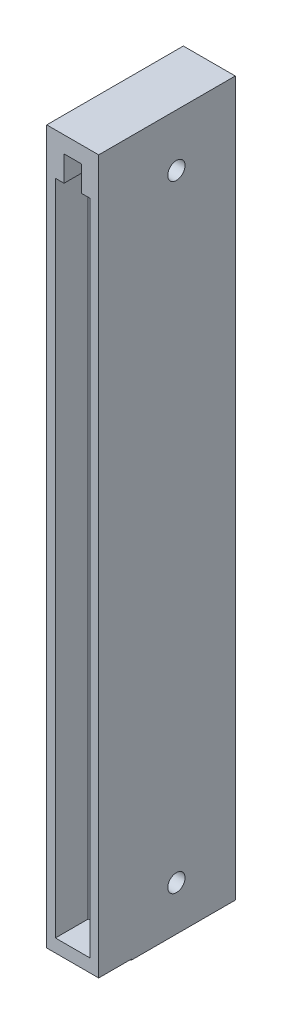
ISO-10303-21;
HEADER;
FILE_DESCRIPTION(('STEP AP214'),'2;1');
FILE_NAME('part.step','',(''),(''),'','','');
FILE_SCHEMA(('AUTOMOTIVE_DESIGN { 1 0 10303 214 1 1 1 1 }'));
ENDSEC;
DATA;
#1=APPLICATION_CONTEXT('core data for automotive mechanical design processes');
#2=APPLICATION_PROTOCOL_DEFINITION('international standard','automotive_design',2000,#1);
#3=PRODUCT_CONTEXT('',#1,'mechanical');
#4=PRODUCT('Part','Part','',(#3));
#5=PRODUCT_RELATED_PRODUCT_CATEGORY('part','',(#4));
#6=PRODUCT_DEFINITION_FORMATION('','',#4);
#7=PRODUCT_DEFINITION_CONTEXT('part definition',#1,'design');
#8=PRODUCT_DEFINITION('design','',#6,#7);
#9=PRODUCT_DEFINITION_SHAPE('','',#8);
#10=(LENGTH_UNIT() NAMED_UNIT(*) SI_UNIT(.MILLI.,.METRE.));
#11=(NAMED_UNIT(*) PLANE_ANGLE_UNIT() SI_UNIT($,.RADIAN.));
#12=(NAMED_UNIT(*) SI_UNIT($,.STERADIAN.) SOLID_ANGLE_UNIT());
#13=UNCERTAINTY_MEASURE_WITH_UNIT(LENGTH_MEASURE(1.E-05),#10,'distance_accuracy_value','');
#14=(GEOMETRIC_REPRESENTATION_CONTEXT(3) GLOBAL_UNCERTAINTY_ASSIGNED_CONTEXT((#13)) GLOBAL_UNIT_ASSIGNED_CONTEXT((#10,
#11,#12)) REPRESENTATION_CONTEXT('',''));
#15=CARTESIAN_POINT('',(0.,0.,0.));
#16=DIRECTION('',(0.,0.,1.));
#17=DIRECTION('',(1.,0.,0.));
#18=AXIS2_PLACEMENT_3D('',#15,#16,#17);
#19=CARTESIAN_POINT('',(0.,3.78055355695,6.89));
#20=DIRECTION('',(0.,-1.,0.));
#21=DIRECTION('',(0.,0.,-1.));
#22=AXIS2_PLACEMENT_3D('',#19,#20,#21);
#23=PLANE('',#22);
#24=DIRECTION('',(-1.,0.,0.));
#25=VECTOR('',#24,1.);
#26=CARTESIAN_POINT('',(0.,3.78055355695,6.89));
#27=LINE('',#26,#25);
#28=CARTESIAN_POINT('',(-1.65652113540989,3.78055355695,6.89));
#29=VERTEX_POINT('',#28);
#30=CARTESIAN_POINT('',(-2.15533980582524,3.78055355695,6.89));
#31=VERTEX_POINT('',#30);
#32=EDGE_CURVE('E240',#29,#31,#27,.T.);
#33=ORIENTED_EDGE('',*,*,#32,.T.);
#34=DIRECTION('',(0.,0.,-1.));
#35=VECTOR('',#34,1.);
#36=CARTESIAN_POINT('',(-2.15533980582524,3.78055355695,6.89));
#37=LINE('',#36,#35);
#38=CARTESIAN_POINT('',(-2.15533980582524,3.78055355695,5.));
#39=VERTEX_POINT('',#38);
#40=EDGE_CURVE('E189',#31,#39,#37,.T.);
#41=ORIENTED_EDGE('',*,*,#40,.T.);
#42=DIRECTION('',(1.,0.,0.));
#43=VECTOR('',#42,1.);
#44=CARTESIAN_POINT('',(0.,3.78055355695,5.));
#45=LINE('',#44,#43);
#46=CARTESIAN_POINT('',(-1.65652113540989,3.78055355695,5.));
#47=VERTEX_POINT('',#46);
#48=EDGE_CURVE('E44',#39,#47,#45,.T.);
#49=ORIENTED_EDGE('',*,*,#48,.T.);
#50=DIRECTION('',(0.,0.,-1.));
#51=VECTOR('',#50,1.);
#52=CARTESIAN_POINT('',(-1.65652113540989,3.78055355695,6.89));
#53=LINE('',#52,#51);
#54=EDGE_CURVE('E257',#29,#47,#53,.T.);
#55=ORIENTED_EDGE('',*,*,#54,.F.);
#56=EDGE_LOOP('',(#33,#41,#49,#55));
#57=FACE_BOUND('',#56,.T.);
#58=ADVANCED_FACE('F35',(#57),#23,.T.);
#59=CARTESIAN_POINT('',(0.,0.,6.89));
#60=DIRECTION('',(0.,0.,1.));
#61=DIRECTION('',(1.,0.,0.));
#62=AXIS2_PLACEMENT_3D('',#59,#60,#61);
#63=PLANE('',#62);
#64=DIRECTION('',(-1.,0.,0.));
#65=VECTOR('',#64,1.);
#66=CARTESIAN_POINT('',(-4.65533980582524,6.20145631067961,6.89));
#67=LINE('',#66,#65);
#68=CARTESIAN_POINT('',(-1.15533980582524,6.20145631067961,6.89));
#69=VERTEX_POINT('',#68);
#70=CARTESIAN_POINT('',(-4.15533980582524,6.20145631067961,6.89));
#71=VERTEX_POINT('',#70);
#72=EDGE_CURVE('E274',#69,#71,#67,.T.);
#73=ORIENTED_EDGE('',*,*,#72,.T.);
#74=DIRECTION('',(0.,-1.,0.));
#75=VECTOR('',#74,1.);
#76=CARTESIAN_POINT('',(-4.15533980582524,10.0218446601942,6.89));
#77=LINE('',#76,#75);
#78=CARTESIAN_POINT('',(-4.15533980582524,-34.9781553398058,6.89));
#79=VERTEX_POINT('',#78);
#80=EDGE_CURVE('E268',#71,#79,#77,.T.);
#81=ORIENTED_EDGE('',*,*,#80,.T.);
#82=DIRECTION('',(-1.,0.,0.));
#83=VECTOR('',#82,1.);
#84=CARTESIAN_POINT('',(-4.15533980582524,-34.9781553398058,6.89));
#85=LINE('',#84,#83);
#86=CARTESIAN_POINT('',(-1.15533980582524,-34.9781553398058,6.89));
#87=VERTEX_POINT('',#86);
#88=EDGE_CURVE('E265',#87,#79,#85,.T.);
#89=ORIENTED_EDGE('',*,*,#88,.F.);
#90=DIRECTION('',(0.,1.,0.));
#91=VECTOR('',#90,1.);
#92=CARTESIAN_POINT('',(-1.15533980582524,6.20145631067961,6.89));
#93=LINE('',#92,#91);
#94=EDGE_CURVE('E272',#87,#69,#93,.T.);
#95=ORIENTED_EDGE('',*,*,#94,.T.);
#96=EDGE_LOOP('',(#73,#81,#89,#95));
#97=FACE_BOUND('',#96,.T.);
#98=DIRECTION('',(1.,0.,0.));
#99=VECTOR('',#98,1.);
#100=CARTESIAN_POINT('',(0.,5.25087105186164,6.89));
#101=LINE('',#100,#99);
#102=CARTESIAN_POINT('',(-3.15533980582524,5.25087105186164,6.89));
#103=VERTEX_POINT('',#102);
#104=CARTESIAN_POINT('',(-2.15533980582524,5.25087105186164,6.89));
#105=VERTEX_POINT('',#104);
#106=EDGE_CURVE('E159',#103,#105,#101,.T.);
#107=ORIENTED_EDGE('',*,*,#106,.T.);
#108=DIRECTION('',(0.,-1.,0.));
#109=VECTOR('',#108,1.);
#110=CARTESIAN_POINT('',(-2.15533980582524,0.,6.89));
#111=LINE('',#110,#109);
#112=EDGE_CURVE('E192',#105,#31,#111,.T.);
#113=ORIENTED_EDGE('',*,*,#112,.T.);
#114=ORIENTED_EDGE('',*,*,#32,.F.);
#115=DIRECTION('',(0.,-1.,0.));
#116=VECTOR('',#115,1.);
#117=CARTESIAN_POINT('',(-1.65652113540989,0.,6.89));
#118=LINE('',#117,#116);
#119=CARTESIAN_POINT('',(-1.65652113540989,-34.2252195986513,6.89));
#120=VERTEX_POINT('',#119);
#121=EDGE_CURVE('E243',#29,#120,#118,.T.);
#122=ORIENTED_EDGE('',*,*,#121,.T.);
#123=DIRECTION('',(-1.,0.,0.));
#124=VECTOR('',#123,1.);
#125=CARTESIAN_POINT('',(0.,-34.2252195986513,6.89));
#126=LINE('',#125,#124);
#127=CARTESIAN_POINT('',(-3.65415847624059,-34.2252195986513,6.89));
#128=VERTEX_POINT('',#127);
#129=EDGE_CURVE('E246',#120,#128,#126,.T.);
#130=ORIENTED_EDGE('',*,*,#129,.T.);
#131=DIRECTION('',(0.,-1.,0.));
#132=VECTOR('',#131,1.);
#133=CARTESIAN_POINT('',(-3.65415847624059,0.,6.89));
#134=LINE('',#133,#132);
#135=CARTESIAN_POINT('',(-3.65415847624059,3.78055355695,6.89));
#136=VERTEX_POINT('',#135);
#137=EDGE_CURVE('E237',#136,#128,#134,.T.);
#138=ORIENTED_EDGE('',*,*,#137,.F.);
#139=CARTESIAN_POINT('',(-3.15533980582524,3.78055355695,6.89));
#140=VERTEX_POINT('',#139);
#141=EDGE_CURVE('E239',#140,#136,#27,.T.);
#142=ORIENTED_EDGE('',*,*,#141,.F.);
#143=DIRECTION('',(0.,-1.,0.));
#144=VECTOR('',#143,1.);
#145=CARTESIAN_POINT('',(-3.15533980582524,0.,6.89));
#146=LINE('',#145,#144);
#147=EDGE_CURVE('E184',#103,#140,#146,.T.);
#148=ORIENTED_EDGE('',*,*,#147,.F.);
#149=EDGE_LOOP('',(#107,#113,#114,#122,#130,#138,#142,#148));
#150=FACE_BOUND('',#149,.T.);
#151=ADVANCED_FACE('F309',(#97,#150),#63,.T.);
#152=CARTESIAN_POINT('',(40.5102416902856,6.20145631067961,5.00000000000001));
#153=DIRECTION('',(0.,0.,-1.));
#154=DIRECTION('',(-1.,0.,0.));
#155=AXIS2_PLACEMENT_3D('',#152,#153,#154);
#156=PLANE('',#155);
#157=DIRECTION('',(0.,1.,0.));
#158=VECTOR('',#157,1.);
#159=CARTESIAN_POINT('',(-2.15533980582524,6.20145631067961,5.));
#160=LINE('',#159,#158);
#161=CARTESIAN_POINT('',(-2.15533980582524,-31.1920413834387,5.));
#162=VERTEX_POINT('',#161);
#163=EDGE_CURVE('E187',#162,#39,#160,.T.);
#164=ORIENTED_EDGE('',*,*,#163,.F.);
#165=DIRECTION('',(-1.,0.,0.));
#166=VECTOR('',#165,1.);
#167=CARTESIAN_POINT('',(40.5102416902856,-31.1920413834387,5.00000000000001));
#168=LINE('',#167,#166);
#169=CARTESIAN_POINT('',(-3.15533980582524,-31.1920413834387,5.));
#170=VERTEX_POINT('',#169);
#171=EDGE_CURVE('E195',#162,#170,#168,.T.);
#172=ORIENTED_EDGE('',*,*,#171,.T.);
#173=DIRECTION('',(0.,1.,0.));
#174=VECTOR('',#173,1.);
#175=CARTESIAN_POINT('',(-3.15533980582524,6.20145631067961,5.));
#176=LINE('',#175,#174);
#177=CARTESIAN_POINT('',(-3.15533980582524,3.78055355695,5.));
#178=VERTEX_POINT('',#177);
#179=EDGE_CURVE('E179',#170,#178,#176,.T.);
#180=ORIENTED_EDGE('',*,*,#179,.T.);
#181=CARTESIAN_POINT('',(-3.65415847624059,3.78055355695,5.));
#182=VERTEX_POINT('',#181);
#183=EDGE_CURVE('E11',#182,#178,#45,.T.);
#184=ORIENTED_EDGE('',*,*,#183,.F.);
#185=DIRECTION('',(0.,1.,0.));
#186=VECTOR('',#185,1.);
#187=CARTESIAN_POINT('',(-3.65415847624059,0.,5.));
#188=LINE('',#187,#186);
#189=CARTESIAN_POINT('',(-3.65415847624059,-34.2252195986513,5.));
#190=VERTEX_POINT('',#189);
#191=EDGE_CURVE('E231',#190,#182,#188,.T.);
#192=ORIENTED_EDGE('',*,*,#191,.F.);
#193=DIRECTION('',(1.,0.,0.));
#194=VECTOR('',#193,1.);
#195=CARTESIAN_POINT('',(0.,-34.2252195986513,5.));
#196=LINE('',#195,#194);
#197=CARTESIAN_POINT('',(-1.65652113540989,-34.2252195986513,5.));
#198=VERTEX_POINT('',#197);
#199=EDGE_CURVE('E229',#190,#198,#196,.T.);
#200=ORIENTED_EDGE('',*,*,#199,.T.);
#201=DIRECTION('',(0.,1.,0.));
#202=VECTOR('',#201,1.);
#203=CARTESIAN_POINT('',(-1.65652113540989,0.,5.));
#204=LINE('',#203,#202);
#205=EDGE_CURVE('E208',#198,#47,#204,.T.);
#206=ORIENTED_EDGE('',*,*,#205,.T.);
#207=ORIENTED_EDGE('',*,*,#48,.F.);
#208=EDGE_LOOP('',(#164,#172,#180,#184,#192,#200,#206,#207));
#209=FACE_BOUND('',#208,.T.);
#210=ADVANCED_FACE('F323',(#209),#156,.F.);
#211=CARTESIAN_POINT('',(0.,-34.9781553398058,0.));
#212=DIRECTION('',(0.,-1.,0.));
#213=DIRECTION('',(0.,0.,-1.));
#214=AXIS2_PLACEMENT_3D('',#211,#212,#213);
#215=PLANE('',#214);
#216=DIRECTION('',(0.,0.,-1.));
#217=VECTOR('',#216,1.);
#218=CARTESIAN_POINT('',(-4.15533980582524,-34.9781553398058,6.89));
#219=LINE('',#218,#217);
#220=CARTESIAN_POINT('',(-4.15533980582524,-34.9781553398058,5.));
#221=VERTEX_POINT('',#220);
#222=EDGE_CURVE('E253',#79,#221,#219,.T.);
#223=ORIENTED_EDGE('',*,*,#222,.T.);
#224=DIRECTION('',(1.,0.,0.));
#225=VECTOR('',#224,1.);
#226=CARTESIAN_POINT('',(0.,-34.9781553398058,5.));
#227=LINE('',#226,#225);
#228=CARTESIAN_POINT('',(-1.15533980582524,-34.9781553398058,5.));
#229=VERTEX_POINT('',#228);
#230=EDGE_CURVE('E234',#221,#229,#227,.T.);
#231=ORIENTED_EDGE('',*,*,#230,.T.);
#232=DIRECTION('',(0.,0.,1.));
#233=VECTOR('',#232,1.);
#234=CARTESIAN_POINT('',(-1.15533980582524,-34.9781553398058,6.89));
#235=LINE('',#234,#233);
#236=EDGE_CURVE('E263',#229,#87,#235,.T.);
#237=ORIENTED_EDGE('',*,*,#236,.T.);
#238=ORIENTED_EDGE('',*,*,#88,.T.);
#239=EDGE_LOOP('',(#223,#231,#237,#238));
#240=FACE_BOUND('',#239,.T.);
#241=ADVANCED_FACE('F307',(#240),#215,.T.);
#242=CARTESIAN_POINT('',(-3.65415847624059,0.,6.89));
#243=DIRECTION('',(1.,0.,0.));
#244=DIRECTION('',(0.,0.,-1.));
#245=AXIS2_PLACEMENT_3D('',#242,#243,#244);
#246=PLANE('',#245);
#247=DIRECTION('',(0.,0.,-1.));
#248=VECTOR('',#247,1.);
#249=CARTESIAN_POINT('',(-3.65415847624059,-34.2252195986513,6.89));
#250=LINE('',#249,#248);
#251=EDGE_CURVE('E250',#128,#190,#250,.T.);
#252=ORIENTED_EDGE('',*,*,#251,.T.);
#253=ORIENTED_EDGE('',*,*,#191,.T.);
#254=DIRECTION('',(0.,0.,-1.));
#255=VECTOR('',#254,1.);
#256=CARTESIAN_POINT('',(-3.65415847624059,3.78055355695,6.89));
#257=LINE('',#256,#255);
#258=EDGE_CURVE('E249',#136,#182,#257,.T.);
#259=ORIENTED_EDGE('',*,*,#258,.F.);
#260=ORIENTED_EDGE('',*,*,#137,.T.);
#261=EDGE_LOOP('',(#252,#253,#259,#260));
#262=FACE_BOUND('',#261,.T.);
#263=ADVANCED_FACE('F351',(#262),#246,.T.);
#264=CARTESIAN_POINT('',(0.,-34.2252195986513,6.89));
#265=DIRECTION('',(0.,-1.,0.));
#266=DIRECTION('',(0.,0.,-1.));
#267=AXIS2_PLACEMENT_3D('',#264,#265,#266);
#268=PLANE('',#267);
#269=ORIENTED_EDGE('',*,*,#199,.F.);
#270=ORIENTED_EDGE('',*,*,#251,.F.);
#271=ORIENTED_EDGE('',*,*,#129,.F.);
#272=DIRECTION('',(0.,0.,-1.));
#273=VECTOR('',#272,1.);
#274=CARTESIAN_POINT('',(-1.65652113540989,-34.2252195986513,6.89));
#275=LINE('',#274,#273);
#276=EDGE_CURVE('E254',#120,#198,#275,.T.);
#277=ORIENTED_EDGE('',*,*,#276,.T.);
#278=EDGE_LOOP('',(#269,#270,#271,#277));
#279=FACE_BOUND('',#278,.T.);
#280=ADVANCED_FACE('F343',(#279),#268,.F.);
#281=CARTESIAN_POINT('',(-1.65652113540989,0.,6.89));
#282=DIRECTION('',(1.,0.,0.));
#283=DIRECTION('',(0.,0.,-1.));
#284=AXIS2_PLACEMENT_3D('',#281,#282,#283);
#285=PLANE('',#284);
#286=ORIENTED_EDGE('',*,*,#205,.F.);
#287=ORIENTED_EDGE('',*,*,#276,.F.);
#288=ORIENTED_EDGE('',*,*,#121,.F.);
#289=ORIENTED_EDGE('',*,*,#54,.T.);
#290=EDGE_LOOP('',(#286,#287,#288,#289));
#291=FACE_BOUND('',#290,.T.);
#292=ADVANCED_FACE('F337',(#291),#285,.F.);
#293=DIRECTION('',(0.,0.,-1.));
#294=VECTOR('',#293,1.);
#295=CARTESIAN_POINT('',(-3.15533980582524,3.78055355695,6.89));
#296=LINE('',#295,#294);
#297=EDGE_CURVE('E52',#140,#178,#296,.T.);
#298=ORIENTED_EDGE('',*,*,#297,.F.);
#299=ORIENTED_EDGE('',*,*,#141,.T.);
#300=ORIENTED_EDGE('',*,*,#258,.T.);
#301=ORIENTED_EDGE('',*,*,#183,.T.);
#302=EDGE_LOOP('',(#298,#299,#300,#301));
#303=FACE_BOUND('',#302,.T.);
#304=ADVANCED_FACE('F329',(#303),#23,.T.);
#305=CARTESIAN_POINT('',(-4.65533980582524,6.20145631067961,6.89));
#306=DIRECTION('',(0.,-1.,0.));
#307=DIRECTION('',(0.,0.,-1.));
#308=AXIS2_PLACEMENT_3D('',#305,#306,#307);
#309=PLANE('',#308);
#310=DIRECTION('',(-1.,0.,0.));
#311=VECTOR('',#310,1.);
#312=CARTESIAN_POINT('',(40.5102416902857,6.20145631067961,-0.99999999999999));
#313=LINE('',#312,#311);
#314=CARTESIAN_POINT('',(-1.15533980582524,6.20145631067961,-1.));
#315=VERTEX_POINT('',#314);
#316=CARTESIAN_POINT('',(-4.15533980582524,6.20145631067961,-1.));
#317=VERTEX_POINT('',#316);
#318=EDGE_CURVE('E220',#315,#317,#313,.T.);
#319=ORIENTED_EDGE('',*,*,#318,.T.);
#320=DIRECTION('',(0.,0.,-1.));
#321=VECTOR('',#320,1.);
#322=CARTESIAN_POINT('',(-4.15533980582524,6.20145631067961,6.89));
#323=LINE('',#322,#321);
#324=EDGE_CURVE('E270',#71,#317,#323,.T.);
#325=ORIENTED_EDGE('',*,*,#324,.F.);
#326=ORIENTED_EDGE('',*,*,#72,.F.);
#327=DIRECTION('',(0.,0.,-1.));
#328=VECTOR('',#327,1.);
#329=CARTESIAN_POINT('',(-1.15533980582524,6.20145631067961,6.89));
#330=LINE('',#329,#328);
#331=EDGE_CURVE('E277',#69,#315,#330,.T.);
#332=ORIENTED_EDGE('',*,*,#331,.T.);
#333=EDGE_LOOP('',(#319,#325,#326,#332));
#334=FACE_BOUND('',#333,.T.);
#335=ADVANCED_FACE('F314',(#334),#309,.F.);
#336=CARTESIAN_POINT('',(-1.15533980582524,6.20145631067961,6.89));
#337=DIRECTION('',(-1.,0.,0.));
#338=DIRECTION('',(0.,0.,1.));
#339=AXIS2_PLACEMENT_3D('',#336,#337,#338);
#340=PLANE('',#339);
#341=CARTESIAN_POINT('',(-1.15533980582522,3.17687625785842,2.4));
#342=DIRECTION('',(-1.,0.,0.));
#343=DIRECTION('',(0.,0.,1.));
#344=AXIS2_PLACEMENT_3D('',#341,#342,#343);
#345=CIRCLE('',#344,0.5);
#346=CARTESIAN_POINT('',(-1.15533980582522,3.17687625785842,2.9));
#347=VERTEX_POINT('',#346);
#348=EDGE_CURVE('E371',#347,#347,#345,.T.);
#349=ORIENTED_EDGE('',*,*,#348,.T.);
#350=EDGE_LOOP('',(#349));
#351=FACE_BOUND('',#350,.T.);
#352=CARTESIAN_POINT('',(-1.15533980582522,-32.4527383785784,2.4));
#353=DIRECTION('',(-1.,0.,0.));
#354=DIRECTION('',(0.,0.,1.));
#355=AXIS2_PLACEMENT_3D('',#352,#353,#354);
#356=CIRCLE('',#355,0.5);
#357=CARTESIAN_POINT('',(-1.15533980582522,-32.4527383785784,2.9));
#358=VERTEX_POINT('',#357);
#359=EDGE_CURVE('E198',#358,#358,#356,.T.);
#360=ORIENTED_EDGE('',*,*,#359,.T.);
#361=EDGE_LOOP('',(#360));
#362=FACE_BOUND('',#361,.T.);
#363=DIRECTION('',(0.,1.,0.));
#364=VECTOR('',#363,1.);
#365=CARTESIAN_POINT('',(-1.15533980582524,6.20145631067961,-0.999999999999999));
#366=LINE('',#365,#364);
#367=CARTESIAN_POINT('',(-1.15533980582524,-35.0298507436579,-0.999999999999999));
#368=VERTEX_POINT('',#367);
#369=EDGE_CURVE('E202',#368,#315,#366,.T.);
#370=ORIENTED_EDGE('',*,*,#369,.T.);
#371=ORIENTED_EDGE('',*,*,#331,.F.);
#372=ORIENTED_EDGE('',*,*,#94,.F.);
#373=ORIENTED_EDGE('',*,*,#236,.F.);
#374=DIRECTION('',(0.,1.,0.));
#375=VECTOR('',#374,1.);
#376=CARTESIAN_POINT('',(-1.15533980582524,6.20145631067961,5.));
#377=LINE('',#376,#375);
#378=CARTESIAN_POINT('',(-1.15533980582524,-35.0298507436579,5.));
#379=VERTEX_POINT('',#378);
#380=EDGE_CURVE('E206',#379,#229,#377,.T.);
#381=ORIENTED_EDGE('',*,*,#380,.F.);
#382=DIRECTION('',(0.,0.,-1.));
#383=VECTOR('',#382,1.);
#384=CARTESIAN_POINT('',(-1.15533980582524,-35.0298507436579,-0.99999999999999));
#385=LINE('',#384,#383);
#386=EDGE_CURVE('E205',#379,#368,#385,.T.);
#387=ORIENTED_EDGE('',*,*,#386,.T.);
#388=EDGE_LOOP('',(#370,#371,#372,#373,#381,#387));
#389=FACE_BOUND('',#388,.T.);
#390=ADVANCED_FACE('F37',(#351,#362,#389),#340,.F.);
#391=CARTESIAN_POINT('',(-4.15533980582524,10.0218446601942,0.));
#392=DIRECTION('',(-1.,0.,0.));
#393=DIRECTION('',(0.,0.,1.));
#394=AXIS2_PLACEMENT_3D('',#391,#392,#393);
#395=PLANE('',#394);
#396=CARTESIAN_POINT('',(-4.15533980582524,3.17687625785842,2.4));
#397=DIRECTION('',(-1.,0.,0.));
#398=DIRECTION('',(0.,0.,1.));
#399=AXIS2_PLACEMENT_3D('',#396,#397,#398);
#400=CIRCLE('',#399,0.5);
#401=CARTESIAN_POINT('',(-4.15533980582524,3.17687625785842,2.9));
#402=VERTEX_POINT('',#401);
#403=EDGE_CURVE('E364',#402,#402,#400,.T.);
#404=ORIENTED_EDGE('',*,*,#403,.F.);
#405=EDGE_LOOP('',(#404));
#406=FACE_BOUND('',#405,.T.);
#407=CARTESIAN_POINT('',(-4.15533980582524,-32.4527383785784,2.4));
#408=DIRECTION('',(-1.,0.,0.));
#409=DIRECTION('',(0.,0.,1.));
#410=AXIS2_PLACEMENT_3D('',#407,#408,#409);
#411=CIRCLE('',#410,0.5);
#412=CARTESIAN_POINT('',(-4.15533980582524,-32.4527383785784,2.9));
#413=VERTEX_POINT('',#412);
#414=EDGE_CURVE('E201',#413,#413,#411,.T.);
#415=ORIENTED_EDGE('',*,*,#414,.F.);
#416=EDGE_LOOP('',(#415));
#417=FACE_BOUND('',#416,.T.);
#418=DIRECTION('',(0.,-1.,0.));
#419=VECTOR('',#418,1.);
#420=CARTESIAN_POINT('',(-4.15533980582524,6.20145631067961,5.));
#421=LINE('',#420,#419);
#422=CARTESIAN_POINT('',(-4.15533980582524,-35.0298507436579,5.));
#423=VERTEX_POINT('',#422);
#424=EDGE_CURVE('E212',#221,#423,#421,.T.);
#425=ORIENTED_EDGE('',*,*,#424,.F.);
#426=ORIENTED_EDGE('',*,*,#222,.F.);
#427=ORIENTED_EDGE('',*,*,#80,.F.);
#428=ORIENTED_EDGE('',*,*,#324,.T.);
#429=DIRECTION('',(0.,-1.,0.));
#430=VECTOR('',#429,1.);
#431=CARTESIAN_POINT('',(-4.15533980582524,6.20145631067961,-1.));
#432=LINE('',#431,#430);
#433=CARTESIAN_POINT('',(-4.15533980582524,-35.0298507436579,-1.));
#434=VERTEX_POINT('',#433);
#435=EDGE_CURVE('E214',#317,#434,#432,.T.);
#436=ORIENTED_EDGE('',*,*,#435,.T.);
#437=DIRECTION('',(0.,0.,1.));
#438=VECTOR('',#437,1.);
#439=CARTESIAN_POINT('',(-4.15533980582524,-35.0298507436579,-1.));
#440=LINE('',#439,#438);
#441=EDGE_CURVE('E209',#434,#423,#440,.T.);
#442=ORIENTED_EDGE('',*,*,#441,.T.);
#443=EDGE_LOOP('',(#425,#426,#427,#428,#436,#442));
#444=FACE_BOUND('',#443,.T.);
#445=ADVANCED_FACE('F284',(#406,#417,#444),#395,.T.);
#446=CARTESIAN_POINT('',(40.5102416902857,-35.0298507436579,-0.99999999999999));
#447=DIRECTION('',(0.,-1.,0.));
#448=DIRECTION('',(0.,0.,-1.));
#449=AXIS2_PLACEMENT_3D('',#446,#447,#448);
#450=PLANE('',#449);
#451=ORIENTED_EDGE('',*,*,#386,.F.);
#452=DIRECTION('',(-1.,0.,0.));
#453=VECTOR('',#452,1.);
#454=CARTESIAN_POINT('',(40.5102416902856,-35.0298507436579,5.00000000000001));
#455=LINE('',#454,#453);
#456=EDGE_CURVE('E217',#379,#423,#455,.T.);
#457=ORIENTED_EDGE('',*,*,#456,.T.);
#458=ORIENTED_EDGE('',*,*,#441,.F.);
#459=DIRECTION('',(-1.,0.,0.));
#460=VECTOR('',#459,1.);
#461=CARTESIAN_POINT('',(40.5102416902857,-35.0298507436579,-0.99999999999999));
#462=LINE('',#461,#460);
#463=EDGE_CURVE('E218',#368,#434,#462,.T.);
#464=ORIENTED_EDGE('',*,*,#463,.F.);
#465=EDGE_LOOP('',(#451,#457,#458,#464));
#466=FACE_BOUND('',#465,.T.);
#467=ADVANCED_FACE('F287',(#466),#450,.T.);
#468=CARTESIAN_POINT('',(40.5102416902857,6.20145631067961,-0.99999999999999));
#469=DIRECTION('',(0.,0.,-1.));
#470=DIRECTION('',(-1.,0.,0.));
#471=AXIS2_PLACEMENT_3D('',#468,#469,#470);
#472=PLANE('',#471);
#473=DIRECTION('',(-1.,0.,0.));
#474=VECTOR('',#473,1.);
#475=CARTESIAN_POINT('',(0.,-31.1920413834387,-0.999999999999999));
#476=LINE('',#475,#474);
#477=CARTESIAN_POINT('',(-2.15533980582524,-31.1920413834387,-0.999999999999999));
#478=VERTEX_POINT('',#477);
#479=CARTESIAN_POINT('',(-3.15533980582524,-31.1920413834387,-0.999999999999999));
#480=VERTEX_POINT('',#479);
#481=EDGE_CURVE('E60',#478,#480,#476,.T.);
#482=ORIENTED_EDGE('',*,*,#481,.F.);
#483=DIRECTION('',(0.,1.,0.));
#484=VECTOR('',#483,1.);
#485=CARTESIAN_POINT('',(-2.15533980582524,0.,-0.999999999999999));
#486=LINE('',#485,#484);
#487=CARTESIAN_POINT('',(-2.15533980582524,5.25087105186164,-0.999999999999999));
#488=VERTEX_POINT('',#487);
#489=EDGE_CURVE('E172',#478,#488,#486,.T.);
#490=ORIENTED_EDGE('',*,*,#489,.T.);
#491=DIRECTION('',(-1.,0.,0.));
#492=VECTOR('',#491,1.);
#493=CARTESIAN_POINT('',(0.,5.25087105186164,-0.999999999999999));
#494=LINE('',#493,#492);
#495=CARTESIAN_POINT('',(-3.15533980582524,5.25087105186164,-0.999999999999999));
#496=VERTEX_POINT('',#495);
#497=EDGE_CURVE('E156',#488,#496,#494,.T.);
#498=ORIENTED_EDGE('',*,*,#497,.T.);
#499=DIRECTION('',(0.,1.,0.));
#500=VECTOR('',#499,1.);
#501=CARTESIAN_POINT('',(-3.15533980582524,0.,-0.999999999999999));
#502=LINE('',#501,#500);
#503=EDGE_CURVE('E165',#480,#496,#502,.T.);
#504=ORIENTED_EDGE('',*,*,#503,.F.);
#505=EDGE_LOOP('',(#482,#490,#498,#504));
#506=FACE_BOUND('',#505,.T.);
#507=ORIENTED_EDGE('',*,*,#369,.F.);
#508=ORIENTED_EDGE('',*,*,#463,.T.);
#509=ORIENTED_EDGE('',*,*,#435,.F.);
#510=ORIENTED_EDGE('',*,*,#318,.F.);
#511=EDGE_LOOP('',(#507,#508,#509,#510));
#512=FACE_BOUND('',#511,.T.);
#513=ADVANCED_FACE('F169',(#506,#512),#472,.T.);
#514=ORIENTED_EDGE('',*,*,#230,.F.);
#515=ORIENTED_EDGE('',*,*,#424,.T.);
#516=ORIENTED_EDGE('',*,*,#456,.F.);
#517=ORIENTED_EDGE('',*,*,#380,.T.);
#518=EDGE_LOOP('',(#514,#515,#516,#517));
#519=FACE_BOUND('',#518,.T.);
#520=ADVANCED_FACE('F296',(#519),#156,.F.);
#521=CARTESIAN_POINT('',(-1.15533980582522,-32.4527383785784,2.4));
#522=DIRECTION('',(-1.,0.,0.));
#523=DIRECTION('',(0.,0.,1.));
#524=AXIS2_PLACEMENT_3D('',#521,#522,#523);
#525=CYLINDRICAL_SURFACE('',#524,0.5);
#526=ORIENTED_EDGE('',*,*,#414,.T.);
#527=EDGE_LOOP('',(#526));
#528=FACE_BOUND('',#527,.T.);
#529=ORIENTED_EDGE('',*,*,#359,.F.);
#530=EDGE_LOOP('',(#529));
#531=FACE_BOUND('',#530,.T.);
#532=ADVANCED_FACE('F281',(#528,#531),#525,.F.);
#533=CARTESIAN_POINT('',(0.,-31.1920413834387,41.));
#534=DIRECTION('',(0.,-1.,0.));
#535=DIRECTION('',(0.,0.,-1.));
#536=AXIS2_PLACEMENT_3D('',#533,#534,#535);
#537=PLANE('',#536);
#538=DIRECTION('',(0.,0.,-1.));
#539=VECTOR('',#538,1.);
#540=CARTESIAN_POINT('',(-2.15533980582525,-31.1920413834387,41.));
#541=LINE('',#540,#539);
#542=EDGE_CURVE('E177',#162,#478,#541,.T.);
#543=ORIENTED_EDGE('',*,*,#542,.T.);
#544=ORIENTED_EDGE('',*,*,#481,.T.);
#545=DIRECTION('',(0.,0.,-1.));
#546=VECTOR('',#545,1.);
#547=CARTESIAN_POINT('',(-3.15533980582525,-31.1920413834387,41.));
#548=LINE('',#547,#546);
#549=EDGE_CURVE('E162',#170,#480,#548,.T.);
#550=ORIENTED_EDGE('',*,*,#549,.F.);
#551=ORIENTED_EDGE('',*,*,#171,.F.);
#552=EDGE_LOOP('',(#543,#544,#550,#551));
#553=FACE_BOUND('',#552,.T.);
#554=ADVANCED_FACE('F363',(#553),#537,.F.);
#555=CARTESIAN_POINT('',(-2.15533980582525,0.,41.));
#556=DIRECTION('',(-1.,0.,0.));
#557=DIRECTION('',(0.,0.,1.));
#558=AXIS2_PLACEMENT_3D('',#555,#556,#557);
#559=PLANE('',#558);
#560=CARTESIAN_POINT('',(-2.15533980582524,3.17687625785842,2.4));
#561=DIRECTION('',(-1.,0.,0.));
#562=DIRECTION('',(0.,0.,1.));
#563=AXIS2_PLACEMENT_3D('',#560,#561,#562);
#564=CIRCLE('',#563,0.5);
#565=CARTESIAN_POINT('',(-2.15533980582524,3.17687625785842,2.9));
#566=VERTEX_POINT('',#565);
#567=EDGE_CURVE('E366',#566,#566,#564,.T.);
#568=ORIENTED_EDGE('',*,*,#567,.F.);
#569=EDGE_LOOP('',(#568));
#570=FACE_BOUND('',#569,.T.);
#571=DIRECTION('',(0.,0.,-1.));
#572=VECTOR('',#571,1.);
#573=CARTESIAN_POINT('',(-2.15533980582525,5.25087105186164,41.));
#574=LINE('',#573,#572);
#575=EDGE_CURVE('E161',#105,#488,#574,.T.);
#576=ORIENTED_EDGE('',*,*,#575,.T.);
#577=ORIENTED_EDGE('',*,*,#489,.F.);
#578=ORIENTED_EDGE('',*,*,#542,.F.);
#579=ORIENTED_EDGE('',*,*,#163,.T.);
#580=ORIENTED_EDGE('',*,*,#40,.F.);
#581=ORIENTED_EDGE('',*,*,#112,.F.);
#582=EDGE_LOOP('',(#576,#577,#578,#579,#580,#581));
#583=FACE_BOUND('',#582,.T.);
#584=ADVANCED_FACE('F361',(#570,#583),#559,.T.);
#585=CARTESIAN_POINT('',(0.,5.25087105186164,41.));
#586=DIRECTION('',(0.,-1.,0.));
#587=DIRECTION('',(0.,0.,-1.));
#588=AXIS2_PLACEMENT_3D('',#585,#586,#587);
#589=PLANE('',#588);
#590=DIRECTION('',(0.,0.,-1.));
#591=VECTOR('',#590,1.);
#592=CARTESIAN_POINT('',(-3.15533980582525,5.25087105186164,41.));
#593=LINE('',#592,#591);
#594=EDGE_CURVE('E151',#103,#496,#593,.T.);
#595=ORIENTED_EDGE('',*,*,#594,.T.);
#596=ORIENTED_EDGE('',*,*,#497,.F.);
#597=ORIENTED_EDGE('',*,*,#575,.F.);
#598=ORIENTED_EDGE('',*,*,#106,.F.);
#599=EDGE_LOOP('',(#595,#596,#597,#598));
#600=FACE_BOUND('',#599,.T.);
#601=ADVANCED_FACE('F153',(#600),#589,.T.);
#602=CARTESIAN_POINT('',(-3.15533980582525,0.,41.));
#603=DIRECTION('',(-1.,0.,0.));
#604=DIRECTION('',(0.,0.,1.));
#605=AXIS2_PLACEMENT_3D('',#602,#603,#604);
#606=PLANE('',#605);
#607=CARTESIAN_POINT('',(-3.15533980582524,3.17687625785842,2.4));
#608=DIRECTION('',(-1.,0.,0.));
#609=DIRECTION('',(0.,0.,1.));
#610=AXIS2_PLACEMENT_3D('',#607,#608,#609);
#611=CIRCLE('',#610,0.5);
#612=CARTESIAN_POINT('',(-3.15533980582524,3.17687625785842,2.9));
#613=VERTEX_POINT('',#612);
#614=EDGE_CURVE('E39',#613,#613,#611,.T.);
#615=ORIENTED_EDGE('',*,*,#614,.T.);
#616=EDGE_LOOP('',(#615));
#617=FACE_BOUND('',#616,.T.);
#618=ORIENTED_EDGE('',*,*,#147,.T.);
#619=ORIENTED_EDGE('',*,*,#297,.T.);
#620=ORIENTED_EDGE('',*,*,#179,.F.);
#621=ORIENTED_EDGE('',*,*,#549,.T.);
#622=ORIENTED_EDGE('',*,*,#503,.T.);
#623=ORIENTED_EDGE('',*,*,#594,.F.);
#624=EDGE_LOOP('',(#618,#619,#620,#621,#622,#623));
#625=FACE_BOUND('',#624,.T.);
#626=ADVANCED_FACE('F166',(#617,#625),#606,.F.);
#627=CARTESIAN_POINT('',(-1.15533980582522,3.17687625785842,2.4));
#628=DIRECTION('',(-1.,0.,0.));
#629=DIRECTION('',(0.,0.,1.));
#630=AXIS2_PLACEMENT_3D('',#627,#628,#629);
#631=CYLINDRICAL_SURFACE('',#630,0.5);
#632=ORIENTED_EDGE('',*,*,#403,.T.);
#633=EDGE_LOOP('',(#632));
#634=FACE_BOUND('',#633,.T.);
#635=ORIENTED_EDGE('',*,*,#614,.F.);
#636=EDGE_LOOP('',(#635));
#637=FACE_BOUND('',#636,.T.);
#638=ADVANCED_FACE('F379',(#634,#637),#631,.F.);
#639=ORIENTED_EDGE('',*,*,#567,.T.);
#640=EDGE_LOOP('',(#639));
#641=FACE_BOUND('',#640,.T.);
#642=ORIENTED_EDGE('',*,*,#348,.F.);
#643=EDGE_LOOP('',(#642));
#644=FACE_BOUND('',#643,.T.);
#645=ADVANCED_FACE('F381',(#641,#644),#631,.F.);
#646=CLOSED_SHELL('',(#58,#151,#210,#241,#263,#280,#292,#304,#335,#390,#445,#467,#513,#520,#532,
#554,#584,#601,#626,#638,#645));
#647=MANIFOLD_SOLID_BREP('B2',#646);
#648=ADVANCED_BREP_SHAPE_REPRESENTATION('',(#18,#647),#14);
#649=SHAPE_DEFINITION_REPRESENTATION(#9,#648);
ENDSEC;
END-ISO-10303-21;
